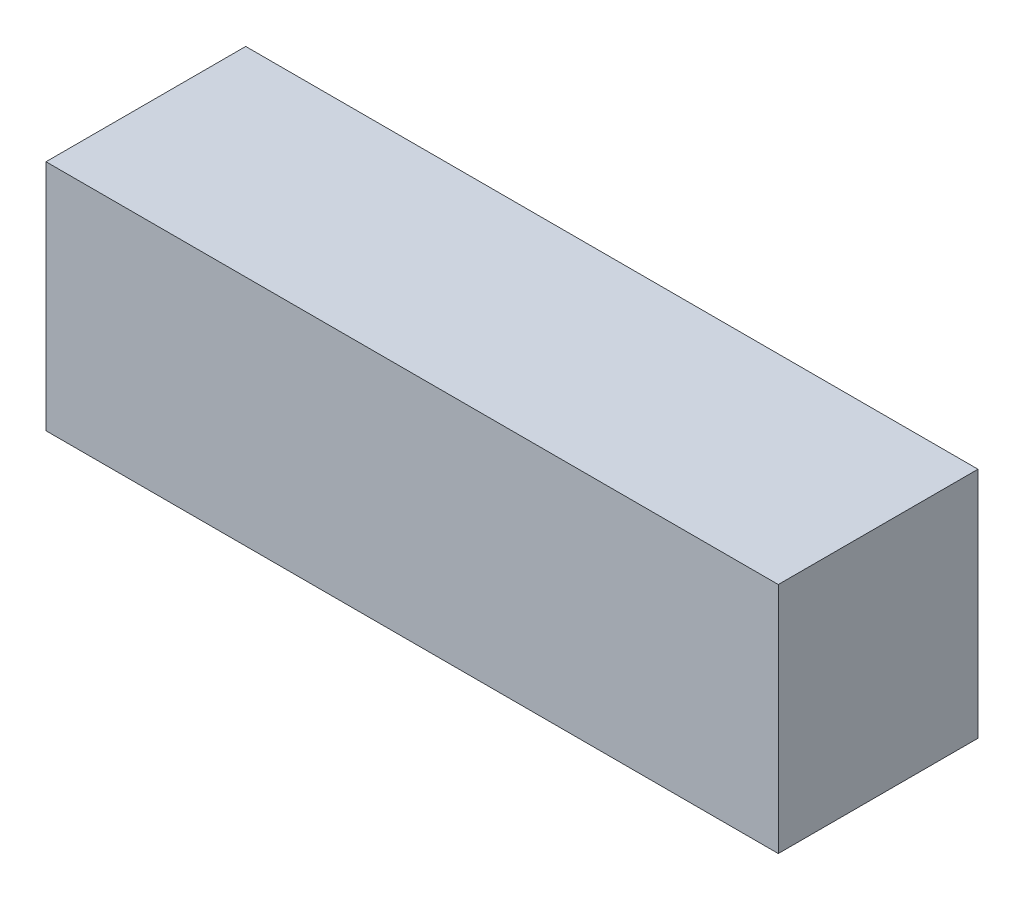
ISO-10303-21;
HEADER;
FILE_DESCRIPTION(('STEP AP214'),'2;1');
FILE_NAME('part.step','',(''),(''),'','','');
FILE_SCHEMA(('AUTOMOTIVE_DESIGN { 1 0 10303 214 1 1 1 1 }'));
ENDSEC;
DATA;
#1=APPLICATION_CONTEXT('core data for automotive mechanical design processes');
#2=APPLICATION_PROTOCOL_DEFINITION('international standard','automotive_design',2000,#1);
#3=PRODUCT_CONTEXT('',#1,'mechanical');
#4=PRODUCT('Part','Part','',(#3));
#5=PRODUCT_RELATED_PRODUCT_CATEGORY('part','',(#4));
#6=PRODUCT_DEFINITION_FORMATION('','',#4);
#7=PRODUCT_DEFINITION_CONTEXT('part definition',#1,'design');
#8=PRODUCT_DEFINITION('design','',#6,#7);
#9=PRODUCT_DEFINITION_SHAPE('','',#8);
#10=(LENGTH_UNIT() NAMED_UNIT(*) SI_UNIT(.MILLI.,.METRE.));
#11=(NAMED_UNIT(*) PLANE_ANGLE_UNIT() SI_UNIT($,.RADIAN.));
#12=(NAMED_UNIT(*) SI_UNIT($,.STERADIAN.) SOLID_ANGLE_UNIT());
#13=UNCERTAINTY_MEASURE_WITH_UNIT(LENGTH_MEASURE(1.E-05),#10,'distance_accuracy_value','');
#14=(GEOMETRIC_REPRESENTATION_CONTEXT(3) GLOBAL_UNCERTAINTY_ASSIGNED_CONTEXT((#13)) GLOBAL_UNIT_ASSIGNED_CONTEXT((#10,
#11,#12)) REPRESENTATION_CONTEXT('',''));
#15=CARTESIAN_POINT('',(0.,0.,0.));
#16=DIRECTION('',(0.,0.,1.));
#17=DIRECTION('',(1.,0.,0.));
#18=AXIS2_PLACEMENT_3D('',#15,#16,#17);
#19=CARTESIAN_POINT('',(0.,0.,25.));
#20=DIRECTION('',(0.,0.,1.));
#21=DIRECTION('',(1.,0.,0.));
#22=AXIS2_PLACEMENT_3D('',#19,#20,#21);
#23=PLANE('',#22);
#24=CARTESIAN_POINT('',(7.5,7.5,25.));
#25=DIRECTION('',(0.,0.,1.));
#26=DIRECTION('',(1.,0.,0.));
#27=AXIS2_PLACEMENT_3D('',#24,#25,#26);
#28=CIRCLE('',#27,2.5);
#29=CARTESIAN_POINT('',(7.5,5.,25.));
#30=VERTEX_POINT('',#29);
#31=CARTESIAN_POINT('',(5.,7.5,25.));
#32=VERTEX_POINT('',#31);
#33=EDGE_CURVE('E20',#30,#32,#28,.F.);
#34=ORIENTED_EDGE('',*,*,#33,.T.);
#35=DIRECTION('',(0.,-1.,0.));
#36=VECTOR('',#35,1.);
#37=CARTESIAN_POINT('',(5.,30.,25.));
#38=LINE('',#37,#36);
#39=CARTESIAN_POINT('',(5.,27.5,25.));
#40=VERTEX_POINT('',#39);
#41=EDGE_CURVE('E109',#32,#40,#38,.F.);
#42=ORIENTED_EDGE('',*,*,#41,.T.);
#43=CARTESIAN_POINT('',(7.50000000000001,27.5,25.));
#44=DIRECTION('',(0.,0.,1.));
#45=DIRECTION('',(1.,0.,0.));
#46=AXIS2_PLACEMENT_3D('',#43,#44,#45);
#47=CIRCLE('',#46,2.5);
#48=CARTESIAN_POINT('',(7.50000000000001,30.,25.));
#49=VERTEX_POINT('',#48);
#50=EDGE_CURVE('E146',#40,#49,#47,.F.);
#51=ORIENTED_EDGE('',*,*,#50,.T.);
#52=DIRECTION('',(-1.,0.,0.));
#53=VECTOR('',#52,1.);
#54=CARTESIAN_POINT('',(5.,30.,25.));
#55=LINE('',#54,#53);
#56=CARTESIAN_POINT('',(27.5,30.,25.));
#57=VERTEX_POINT('',#56);
#58=EDGE_CURVE('E164',#49,#57,#55,.F.);
#59=ORIENTED_EDGE('',*,*,#58,.T.);
#60=CARTESIAN_POINT('',(27.5,27.5,25.));
#61=DIRECTION('',(0.,0.,1.));
#62=DIRECTION('',(1.,0.,0.));
#63=AXIS2_PLACEMENT_3D('',#60,#61,#62);
#64=CIRCLE('',#63,2.5);
#65=CARTESIAN_POINT('',(30.,27.5,25.));
#66=VERTEX_POINT('',#65);
#67=EDGE_CURVE('E148',#57,#66,#64,.F.);
#68=ORIENTED_EDGE('',*,*,#67,.T.);
#69=DIRECTION('',(0.,1.,0.));
#70=VECTOR('',#69,1.);
#71=CARTESIAN_POINT('',(30.,30.,25.));
#72=LINE('',#71,#70);
#73=CARTESIAN_POINT('',(30.,7.49999999999999,25.));
#74=VERTEX_POINT('',#73);
#75=EDGE_CURVE('E131',#66,#74,#72,.F.);
#76=ORIENTED_EDGE('',*,*,#75,.T.);
#77=CARTESIAN_POINT('',(27.5,7.49999999999999,25.));
#78=DIRECTION('',(0.,0.,1.));
#79=DIRECTION('',(1.,0.,0.));
#80=AXIS2_PLACEMENT_3D('',#77,#78,#79);
#81=CIRCLE('',#80,2.5);
#82=CARTESIAN_POINT('',(27.5,4.99999999999999,25.));
#83=VERTEX_POINT('',#82);
#84=EDGE_CURVE('E152',#74,#83,#81,.F.);
#85=ORIENTED_EDGE('',*,*,#84,.T.);
#86=DIRECTION('',(1.,0.,0.));
#87=VECTOR('',#86,1.);
#88=CARTESIAN_POINT('',(5.,5.,25.));
#89=LINE('',#88,#87);
#90=EDGE_CURVE('E124',#83,#30,#89,.F.);
#91=ORIENTED_EDGE('',*,*,#90,.T.);
#92=EDGE_LOOP('',(#34,#42,#51,#59,#68,#76,#85,#91));
#93=FACE_BOUND('',#92,.T.);
#94=ADVANCED_FACE('F17',(#93),#23,.F.);
#95=CARTESIAN_POINT('',(5.,30.,25.));
#96=DIRECTION('',(-1.,0.,0.));
#97=DIRECTION('',(0.,-1.,0.));
#98=AXIS2_PLACEMENT_3D('',#95,#96,#97);
#99=PLANE('',#98);
#100=DIRECTION('',(0.,0.,1.));
#101=VECTOR('',#100,1.);
#102=CARTESIAN_POINT('',(5.,7.5,25.));
#103=LINE('',#102,#101);
#104=CARTESIAN_POINT('',(5.,7.5,0.));
#105=VERTEX_POINT('',#104);
#106=EDGE_CURVE('E112',#32,#105,#103,.F.);
#107=ORIENTED_EDGE('',*,*,#106,.T.);
#108=DIRECTION('',(0.,1.,0.));
#109=VECTOR('',#108,1.);
#110=CARTESIAN_POINT('',(5.,0.,0.));
#111=LINE('',#110,#109);
#112=CARTESIAN_POINT('',(5.,27.5,0.));
#113=VERTEX_POINT('',#112);
#114=EDGE_CURVE('E145',#113,#105,#111,.F.);
#115=ORIENTED_EDGE('',*,*,#114,.F.);
#116=DIRECTION('',(0.,0.,1.));
#117=VECTOR('',#116,1.);
#118=CARTESIAN_POINT('',(5.00000000000001,27.5,25.));
#119=LINE('',#118,#117);
#120=EDGE_CURVE('E114',#113,#40,#119,.T.);
#121=ORIENTED_EDGE('',*,*,#120,.T.);
#122=ORIENTED_EDGE('',*,*,#41,.F.);
#123=EDGE_LOOP('',(#107,#115,#121,#122));
#124=FACE_BOUND('',#123,.T.);
#125=ADVANCED_FACE('F110',(#124),#99,.F.);
#126=CARTESIAN_POINT('',(7.5,7.5,25.));
#127=DIRECTION('',(0.,0.,1.));
#128=DIRECTION('',(1.,0.,0.));
#129=AXIS2_PLACEMENT_3D('',#126,#127,#128);
#130=CYLINDRICAL_SURFACE('',#129,2.5);
#131=DIRECTION('',(0.,0.,1.));
#132=VECTOR('',#131,1.);
#133=CARTESIAN_POINT('',(7.5,5.,25.));
#134=LINE('',#133,#132);
#135=CARTESIAN_POINT('',(7.5,5.,0.));
#136=VERTEX_POINT('',#135);
#137=EDGE_CURVE('E125',#30,#136,#134,.F.);
#138=ORIENTED_EDGE('',*,*,#137,.T.);
#139=CARTESIAN_POINT('',(7.5,7.5,0.));
#140=DIRECTION('',(0.,0.,1.));
#141=DIRECTION('',(1.,0.,0.));
#142=AXIS2_PLACEMENT_3D('',#139,#140,#141);
#143=CIRCLE('',#142,2.5);
#144=EDGE_CURVE('E120',#105,#136,#143,.T.);
#145=ORIENTED_EDGE('',*,*,#144,.F.);
#146=ORIENTED_EDGE('',*,*,#106,.F.);
#147=ORIENTED_EDGE('',*,*,#33,.F.);
#148=EDGE_LOOP('',(#138,#145,#146,#147));
#149=FACE_BOUND('',#148,.T.);
#150=ADVANCED_FACE('F119',(#149),#130,.F.);
#151=CARTESIAN_POINT('',(5.,5.,25.));
#152=DIRECTION('',(0.,-1.,0.));
#153=DIRECTION('',(1.,0.,0.));
#154=AXIS2_PLACEMENT_3D('',#151,#152,#153);
#155=PLANE('',#154);
#156=ORIENTED_EDGE('',*,*,#137,.F.);
#157=ORIENTED_EDGE('',*,*,#90,.F.);
#158=DIRECTION('',(0.,0.,1.));
#159=VECTOR('',#158,1.);
#160=CARTESIAN_POINT('',(27.5,4.99999999999999,25.));
#161=LINE('',#160,#159);
#162=CARTESIAN_POINT('',(27.5,5.,0.));
#163=VERTEX_POINT('',#162);
#164=EDGE_CURVE('E127',#83,#163,#161,.F.);
#165=ORIENTED_EDGE('',*,*,#164,.T.);
#166=DIRECTION('',(-1.,0.,0.));
#167=VECTOR('',#166,1.);
#168=CARTESIAN_POINT('',(0.,5.,0.));
#169=LINE('',#168,#167);
#170=EDGE_CURVE('E143',#136,#163,#169,.F.);
#171=ORIENTED_EDGE('',*,*,#170,.F.);
#172=EDGE_LOOP('',(#156,#157,#165,#171));
#173=FACE_BOUND('',#172,.T.);
#174=ADVANCED_FACE('F329',(#173),#155,.F.);
#175=CARTESIAN_POINT('',(27.5,7.49999999999999,25.));
#176=DIRECTION('',(0.,0.,1.));
#177=DIRECTION('',(1.,0.,0.));
#178=AXIS2_PLACEMENT_3D('',#175,#176,#177);
#179=CYLINDRICAL_SURFACE('',#178,2.5);
#180=DIRECTION('',(0.,0.,1.));
#181=VECTOR('',#180,1.);
#182=CARTESIAN_POINT('',(30.,7.49999999999999,25.));
#183=LINE('',#182,#181);
#184=CARTESIAN_POINT('',(30.,7.49999999999999,0.));
#185=VERTEX_POINT('',#184);
#186=EDGE_CURVE('E153',#74,#185,#183,.F.);
#187=ORIENTED_EDGE('',*,*,#186,.T.);
#188=CARTESIAN_POINT('',(27.5,7.49999999999999,0.));
#189=DIRECTION('',(0.,0.,1.));
#190=DIRECTION('',(1.,0.,0.));
#191=AXIS2_PLACEMENT_3D('',#188,#189,#190);
#192=CIRCLE('',#191,2.5);
#193=EDGE_CURVE('E141',#163,#185,#192,.T.);
#194=ORIENTED_EDGE('',*,*,#193,.F.);
#195=ORIENTED_EDGE('',*,*,#164,.F.);
#196=ORIENTED_EDGE('',*,*,#84,.F.);
#197=EDGE_LOOP('',(#187,#194,#195,#196));
#198=FACE_BOUND('',#197,.T.);
#199=ADVANCED_FACE('F321',(#198),#179,.F.);
#200=CARTESIAN_POINT('',(30.,30.,25.));
#201=DIRECTION('',(1.,0.,0.));
#202=DIRECTION('',(0.,1.,0.));
#203=AXIS2_PLACEMENT_3D('',#200,#201,#202);
#204=PLANE('',#203);
#205=DIRECTION('',(0.,0.,1.));
#206=VECTOR('',#205,1.);
#207=CARTESIAN_POINT('',(30.,27.5,25.));
#208=LINE('',#207,#206);
#209=CARTESIAN_POINT('',(30.,27.5,0.));
#210=VERTEX_POINT('',#209);
#211=EDGE_CURVE('E151',#66,#210,#208,.F.);
#212=ORIENTED_EDGE('',*,*,#211,.T.);
#213=DIRECTION('',(0.,1.,0.));
#214=VECTOR('',#213,1.);
#215=CARTESIAN_POINT('',(30.,0.,0.));
#216=LINE('',#215,#214);
#217=EDGE_CURVE('E140',#185,#210,#216,.T.);
#218=ORIENTED_EDGE('',*,*,#217,.F.);
#219=ORIENTED_EDGE('',*,*,#186,.F.);
#220=ORIENTED_EDGE('',*,*,#75,.F.);
#221=EDGE_LOOP('',(#212,#218,#219,#220));
#222=FACE_BOUND('',#221,.T.);
#223=ADVANCED_FACE('F181',(#222),#204,.F.);
#224=CARTESIAN_POINT('',(27.5,27.5,25.));
#225=DIRECTION('',(0.,0.,1.));
#226=DIRECTION('',(1.,0.,0.));
#227=AXIS2_PLACEMENT_3D('',#224,#225,#226);
#228=CYLINDRICAL_SURFACE('',#227,2.5);
#229=DIRECTION('',(0.,0.,1.));
#230=VECTOR('',#229,1.);
#231=CARTESIAN_POINT('',(27.5,30.,25.));
#232=LINE('',#231,#230);
#233=CARTESIAN_POINT('',(27.5,30.,0.));
#234=VERTEX_POINT('',#233);
#235=EDGE_CURVE('E150',#57,#234,#232,.F.);
#236=ORIENTED_EDGE('',*,*,#235,.T.);
#237=CARTESIAN_POINT('',(27.5,27.5,0.));
#238=DIRECTION('',(0.,0.,1.));
#239=DIRECTION('',(1.,0.,0.));
#240=AXIS2_PLACEMENT_3D('',#237,#238,#239);
#241=CIRCLE('',#240,2.5);
#242=EDGE_CURVE('E138',#210,#234,#241,.T.);
#243=ORIENTED_EDGE('',*,*,#242,.F.);
#244=ORIENTED_EDGE('',*,*,#211,.F.);
#245=ORIENTED_EDGE('',*,*,#67,.F.);
#246=EDGE_LOOP('',(#236,#243,#244,#245));
#247=FACE_BOUND('',#246,.T.);
#248=ADVANCED_FACE('F182',(#247),#228,.F.);
#249=CARTESIAN_POINT('',(5.,30.,25.));
#250=DIRECTION('',(0.,1.,0.));
#251=DIRECTION('',(-1.,0.,0.));
#252=AXIS2_PLACEMENT_3D('',#249,#250,#251);
#253=PLANE('',#252);
#254=DIRECTION('',(0.,0.,1.));
#255=VECTOR('',#254,1.);
#256=CARTESIAN_POINT('',(7.50000000000001,30.,25.));
#257=LINE('',#256,#255);
#258=CARTESIAN_POINT('',(7.50000000000001,30.,0.));
#259=VERTEX_POINT('',#258);
#260=EDGE_CURVE('E166',#49,#259,#257,.F.);
#261=ORIENTED_EDGE('',*,*,#260,.T.);
#262=DIRECTION('',(-1.,0.,0.));
#263=VECTOR('',#262,1.);
#264=CARTESIAN_POINT('',(0.,30.,0.));
#265=LINE('',#264,#263);
#266=EDGE_CURVE('E137',#234,#259,#265,.T.);
#267=ORIENTED_EDGE('',*,*,#266,.F.);
#268=ORIENTED_EDGE('',*,*,#235,.F.);
#269=ORIENTED_EDGE('',*,*,#58,.F.);
#270=EDGE_LOOP('',(#261,#267,#268,#269));
#271=FACE_BOUND('',#270,.T.);
#272=ADVANCED_FACE('F195',(#271),#253,.F.);
#273=CARTESIAN_POINT('',(7.50000000000001,27.5,25.));
#274=DIRECTION('',(0.,0.,1.));
#275=DIRECTION('',(1.,0.,0.));
#276=AXIS2_PLACEMENT_3D('',#273,#274,#275);
#277=CYLINDRICAL_SURFACE('',#276,2.5);
#278=ORIENTED_EDGE('',*,*,#120,.F.);
#279=CARTESIAN_POINT('',(7.50000000000001,27.5,0.));
#280=DIRECTION('',(0.,0.,1.));
#281=DIRECTION('',(1.,0.,0.));
#282=AXIS2_PLACEMENT_3D('',#279,#280,#281);
#283=CIRCLE('',#282,2.5);
#284=EDGE_CURVE('E133',#259,#113,#283,.T.);
#285=ORIENTED_EDGE('',*,*,#284,.F.);
#286=ORIENTED_EDGE('',*,*,#260,.F.);
#287=ORIENTED_EDGE('',*,*,#50,.F.);
#288=EDGE_LOOP('',(#278,#285,#286,#287));
#289=FACE_BOUND('',#288,.T.);
#290=ADVANCED_FACE('F193',(#289),#277,.F.);
#291=CARTESIAN_POINT('',(0.,0.,0.));
#292=DIRECTION('',(0.,0.,-1.));
#293=DIRECTION('',(-1.,0.,0.));
#294=AXIS2_PLACEMENT_3D('',#291,#292,#293);
#295=PLANE('',#294);
#296=DIRECTION('',(0.,1.,0.));
#297=VECTOR('',#296,1.);
#298=CARTESIAN_POINT('',(110.,0.,0.));
#299=LINE('',#298,#297);
#300=CARTESIAN_POINT('',(110.,35.,0.));
#301=VERTEX_POINT('',#300);
#302=CARTESIAN_POINT('',(110.,0.,0.));
#303=VERTEX_POINT('',#302);
#304=EDGE_CURVE('E233',#301,#303,#299,.F.);
#305=ORIENTED_EDGE('',*,*,#304,.T.);
#306=DIRECTION('',(1.,0.,0.));
#307=VECTOR('',#306,1.);
#308=CARTESIAN_POINT('',(0.,0.,0.));
#309=LINE('',#308,#307);
#310=CARTESIAN_POINT('',(0.,0.,0.));
#311=VERTEX_POINT('',#310);
#312=EDGE_CURVE('E236',#303,#311,#309,.F.);
#313=ORIENTED_EDGE('',*,*,#312,.T.);
#314=DIRECTION('',(0.,1.,0.));
#315=VECTOR('',#314,1.);
#316=CARTESIAN_POINT('',(0.,0.,0.));
#317=LINE('',#316,#315);
#318=CARTESIAN_POINT('',(0.,35.,0.));
#319=VERTEX_POINT('',#318);
#320=EDGE_CURVE('E257',#311,#319,#317,.T.);
#321=ORIENTED_EDGE('',*,*,#320,.T.);
#322=DIRECTION('',(1.,0.,0.));
#323=VECTOR('',#322,1.);
#324=CARTESIAN_POINT('',(0.,35.,0.));
#325=LINE('',#324,#323);
#326=EDGE_CURVE('E136',#319,#301,#325,.T.);
#327=ORIENTED_EDGE('',*,*,#326,.T.);
#328=EDGE_LOOP('',(#305,#313,#321,#327));
#329=FACE_BOUND('',#328,.T.);
#330=ORIENTED_EDGE('',*,*,#266,.T.);
#331=ORIENTED_EDGE('',*,*,#284,.T.);
#332=ORIENTED_EDGE('',*,*,#114,.T.);
#333=ORIENTED_EDGE('',*,*,#144,.T.);
#334=ORIENTED_EDGE('',*,*,#170,.T.);
#335=ORIENTED_EDGE('',*,*,#193,.T.);
#336=ORIENTED_EDGE('',*,*,#217,.T.);
#337=ORIENTED_EDGE('',*,*,#242,.T.);
#338=EDGE_LOOP('',(#330,#331,#332,#333,#334,#335,#336,#337));
#339=FACE_BOUND('',#338,.T.);
#340=ADVANCED_FACE('F184',(#329,#339),#295,.T.);
#341=CARTESIAN_POINT('',(0.,35.,30.));
#342=DIRECTION('',(0.,-1.,0.));
#343=DIRECTION('',(0.,0.,-1.));
#344=AXIS2_PLACEMENT_3D('',#341,#342,#343);
#345=PLANE('',#344);
#346=DIRECTION('',(0.,0.,-1.));
#347=VECTOR('',#346,1.);
#348=CARTESIAN_POINT('',(0.,35.,30.));
#349=LINE('',#348,#347);
#350=CARTESIAN_POINT('',(0.,35.,30.));
#351=VERTEX_POINT('',#350);
#352=EDGE_CURVE('E243',#319,#351,#349,.F.);
#353=ORIENTED_EDGE('',*,*,#352,.T.);
#354=DIRECTION('',(-1.,0.,0.));
#355=VECTOR('',#354,1.);
#356=CARTESIAN_POINT('',(0.,35.,30.));
#357=LINE('',#356,#355);
#358=CARTESIAN_POINT('',(110.,35.,30.));
#359=VERTEX_POINT('',#358);
#360=EDGE_CURVE('E254',#351,#359,#357,.F.);
#361=ORIENTED_EDGE('',*,*,#360,.T.);
#362=DIRECTION('',(0.,0.,1.));
#363=VECTOR('',#362,1.);
#364=CARTESIAN_POINT('',(110.,35.,30.));
#365=LINE('',#364,#363);
#366=EDGE_CURVE('E240',#359,#301,#365,.F.);
#367=ORIENTED_EDGE('',*,*,#366,.T.);
#368=ORIENTED_EDGE('',*,*,#326,.F.);
#369=EDGE_LOOP('',(#353,#361,#367,#368));
#370=FACE_BOUND('',#369,.T.);
#371=ADVANCED_FACE('F223',(#370),#345,.F.);
#372=CARTESIAN_POINT('',(110.,0.,30.));
#373=DIRECTION('',(-1.,0.,0.));
#374=DIRECTION('',(0.,0.,1.));
#375=AXIS2_PLACEMENT_3D('',#372,#373,#374);
#376=PLANE('',#375);
#377=ORIENTED_EDGE('',*,*,#366,.F.);
#378=DIRECTION('',(0.,1.,0.));
#379=VECTOR('',#378,1.);
#380=CARTESIAN_POINT('',(110.,0.,30.));
#381=LINE('',#380,#379);
#382=CARTESIAN_POINT('',(110.,0.,30.));
#383=VERTEX_POINT('',#382);
#384=EDGE_CURVE('E247',#359,#383,#381,.F.);
#385=ORIENTED_EDGE('',*,*,#384,.T.);
#386=DIRECTION('',(0.,0.,1.));
#387=VECTOR('',#386,1.);
#388=CARTESIAN_POINT('',(110.,0.,30.));
#389=LINE('',#388,#387);
#390=EDGE_CURVE('E239',#383,#303,#389,.F.);
#391=ORIENTED_EDGE('',*,*,#390,.T.);
#392=ORIENTED_EDGE('',*,*,#304,.F.);
#393=EDGE_LOOP('',(#377,#385,#391,#392));
#394=FACE_BOUND('',#393,.T.);
#395=ADVANCED_FACE('F219',(#394),#376,.F.);
#396=CARTESIAN_POINT('',(0.,0.,30.));
#397=DIRECTION('',(0.,1.,0.));
#398=DIRECTION('',(0.,0.,1.));
#399=AXIS2_PLACEMENT_3D('',#396,#397,#398);
#400=PLANE('',#399);
#401=ORIENTED_EDGE('',*,*,#390,.F.);
#402=DIRECTION('',(-1.,0.,0.));
#403=VECTOR('',#402,1.);
#404=CARTESIAN_POINT('',(0.,0.,30.));
#405=LINE('',#404,#403);
#406=CARTESIAN_POINT('',(0.,0.,30.));
#407=VERTEX_POINT('',#406);
#408=EDGE_CURVE('E26',#383,#407,#405,.T.);
#409=ORIENTED_EDGE('',*,*,#408,.T.);
#410=DIRECTION('',(0.,0.,-1.));
#411=VECTOR('',#410,1.);
#412=CARTESIAN_POINT('',(0.,0.,30.));
#413=LINE('',#412,#411);
#414=EDGE_CURVE('E34',#407,#311,#413,.T.);
#415=ORIENTED_EDGE('',*,*,#414,.T.);
#416=ORIENTED_EDGE('',*,*,#312,.F.);
#417=EDGE_LOOP('',(#401,#409,#415,#416));
#418=FACE_BOUND('',#417,.T.);
#419=ADVANCED_FACE('F213',(#418),#400,.F.);
#420=CARTESIAN_POINT('',(0.,0.,30.));
#421=DIRECTION('',(1.,0.,0.));
#422=DIRECTION('',(0.,0.,-1.));
#423=AXIS2_PLACEMENT_3D('',#420,#421,#422);
#424=PLANE('',#423);
#425=ORIENTED_EDGE('',*,*,#414,.F.);
#426=DIRECTION('',(0.,1.,0.));
#427=VECTOR('',#426,1.);
#428=CARTESIAN_POINT('',(0.,0.,30.));
#429=LINE('',#428,#427);
#430=EDGE_CURVE('E11',#407,#351,#429,.T.);
#431=ORIENTED_EDGE('',*,*,#430,.T.);
#432=ORIENTED_EDGE('',*,*,#352,.F.);
#433=ORIENTED_EDGE('',*,*,#320,.F.);
#434=EDGE_LOOP('',(#425,#431,#432,#433));
#435=FACE_BOUND('',#434,.T.);
#436=ADVANCED_FACE('F207',(#435),#424,.F.);
#437=CARTESIAN_POINT('',(0.,0.,30.));
#438=DIRECTION('',(0.,0.,-1.));
#439=DIRECTION('',(-1.,0.,0.));
#440=AXIS2_PLACEMENT_3D('',#437,#438,#439);
#441=PLANE('',#440);
#442=ORIENTED_EDGE('',*,*,#408,.F.);
#443=ORIENTED_EDGE('',*,*,#384,.F.);
#444=ORIENTED_EDGE('',*,*,#360,.F.);
#445=ORIENTED_EDGE('',*,*,#430,.F.);
#446=EDGE_LOOP('',(#442,#443,#444,#445));
#447=FACE_BOUND('',#446,.T.);
#448=ADVANCED_FACE('F205',(#447),#441,.F.);
#449=CLOSED_SHELL('',(#94,#125,#150,#174,#199,#223,#248,#272,#290,#340,#371,#395,#419,#436,#448));
#450=MANIFOLD_SOLID_BREP('B1',#449);
#451=ADVANCED_BREP_SHAPE_REPRESENTATION('',(#18,#450),#14);
#452=SHAPE_DEFINITION_REPRESENTATION(#9,#451);
ENDSEC;
END-ISO-10303-21;
